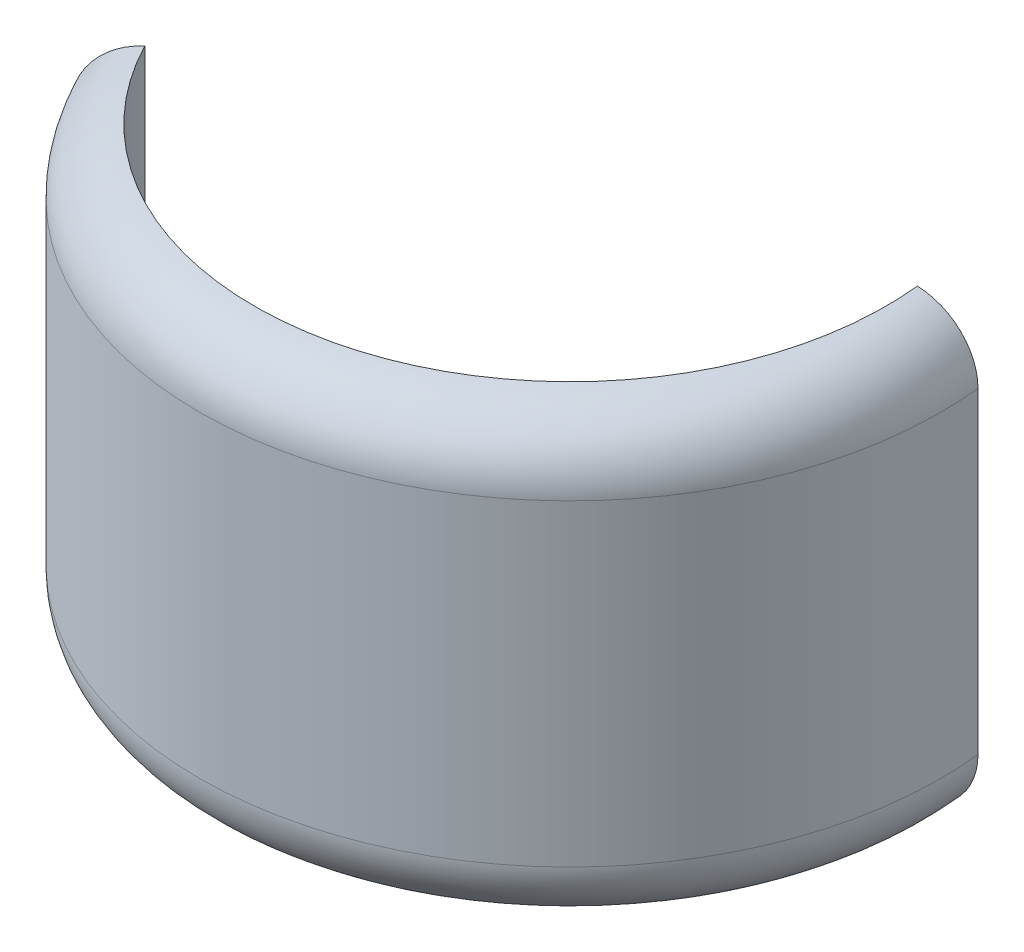
ISO-10303-21;
HEADER;
FILE_DESCRIPTION(('STEP AP214'),'2;1');
FILE_NAME('part.step','',(''),(''),'','','');
FILE_SCHEMA(('AUTOMOTIVE_DESIGN { 1 0 10303 214 1 1 1 1 }'));
ENDSEC;
DATA;
#1=APPLICATION_CONTEXT('core data for automotive mechanical design processes');
#2=APPLICATION_PROTOCOL_DEFINITION('international standard','automotive_design',2000,#1);
#3=PRODUCT_CONTEXT('',#1,'mechanical');
#4=PRODUCT('Part','Part','',(#3));
#5=PRODUCT_RELATED_PRODUCT_CATEGORY('part','',(#4));
#6=PRODUCT_DEFINITION_FORMATION('','',#4);
#7=PRODUCT_DEFINITION_CONTEXT('part definition',#1,'design');
#8=PRODUCT_DEFINITION('design','',#6,#7);
#9=PRODUCT_DEFINITION_SHAPE('','',#8);
#10=(LENGTH_UNIT() NAMED_UNIT(*) SI_UNIT(.MILLI.,.METRE.));
#11=(NAMED_UNIT(*) PLANE_ANGLE_UNIT() SI_UNIT($,.RADIAN.));
#12=(NAMED_UNIT(*) SI_UNIT($,.STERADIAN.) SOLID_ANGLE_UNIT());
#13=UNCERTAINTY_MEASURE_WITH_UNIT(LENGTH_MEASURE(1.E-05),#10,'distance_accuracy_value','');
#14=(GEOMETRIC_REPRESENTATION_CONTEXT(3) GLOBAL_UNCERTAINTY_ASSIGNED_CONTEXT((#13)) GLOBAL_UNIT_ASSIGNED_CONTEXT((#10,
#11,#12)) REPRESENTATION_CONTEXT('',''));
#15=CARTESIAN_POINT('',(0.,0.,0.));
#16=DIRECTION('',(0.,0.,1.));
#17=DIRECTION('',(1.,0.,0.));
#18=AXIS2_PLACEMENT_3D('',#15,#16,#17);
#19=CARTESIAN_POINT('',(-3.77287790207848,24.,-7.28249741853994));
#20=DIRECTION('',(-0.460006586639694,0.,-0.887915502876314));
#21=DIRECTION('',(-0.887915502876314,0.,0.460006586639694));
#22=AXIS2_PLACEMENT_3D('',#19,#20,#21);
#23=PLANE('',#22);
#24=DIRECTION('',(0.,-1.,0.));
#25=VECTOR('',#24,1.);
#26=CARTESIAN_POINT('',(-19.5296602889332,24.,0.880693401669399));
#27=LINE('',#26,#25);
#28=CARTESIAN_POINT('',(-19.5296602889332,24.,0.880693401669399));
#29=VERTEX_POINT('',#28);
#30=CARTESIAN_POINT('',(-19.5296602889332,0.,0.880693401669399));
#31=VERTEX_POINT('',#30);
#32=EDGE_CURVE('E102',#29,#31,#27,.T.);
#33=ORIENTED_EDGE('',*,*,#32,.T.);
#34=CARTESIAN_POINT('',(-19.0562679831169,3.45915464973892,0.635440809463784));
#35=DIRECTION('',(-0.460006586639694,0.,-0.887915502876314));
#36=DIRECTION('',(-0.887915502876314,0.,0.460006586639694));
#37=AXIS2_PLACEMENT_3D('',#34,#35,#36);
#38=CIRCLE('',#37,3.5);
#39=CARTESIAN_POINT('',(-22.163972243184,3.45915464973892,2.24546386270271));
#40=VERTEX_POINT('',#39);
#41=EDGE_CURVE('E11',#31,#40,#38,.T.);
#42=ORIENTED_EDGE('',*,*,#41,.T.);
#43=DIRECTION('',(0.,-1.,0.));
#44=VECTOR('',#43,1.);
#45=CARTESIAN_POINT('',(-22.163972243184,24.,2.24546386270265));
#46=LINE('',#45,#44);
#47=CARTESIAN_POINT('',(-22.163972243184,20.5408453502611,2.24546386270271));
#48=VERTEX_POINT('',#47);
#49=EDGE_CURVE('E116',#48,#40,#46,.T.);
#50=ORIENTED_EDGE('',*,*,#49,.F.);
#51=CARTESIAN_POINT('',(-19.0562679831169,20.5408453502611,0.635440809463784));
#52=DIRECTION('',(-0.460006586639694,0.,-0.887915502876314));
#53=DIRECTION('',(-0.887915502876314,0.,0.460006586639694));
#54=AXIS2_PLACEMENT_3D('',#51,#52,#53);
#55=CIRCLE('',#54,3.5);
#56=EDGE_CURVE('E52',#48,#29,#55,.T.);
#57=ORIENTED_EDGE('',*,*,#56,.T.);
#58=EDGE_LOOP('',(#33,#42,#50,#57));
#59=FACE_BOUND('',#58,.T.);
#60=ADVANCED_FACE('F43',(#59),#23,.T.);
#61=CARTESIAN_POINT('',(-4.43509674003582,24.,-6.93941857120534));
#62=DIRECTION('',(0.,-1.,0.));
#63=DIRECTION('',(0.,0.,-1.));
#64=AXIS2_PLACEMENT_3D('',#61,#62,#63);
#65=CYLINDRICAL_SURFACE('',#64,19.9668498249183);
#66=ORIENTED_EDGE('',*,*,#49,.T.);
#67=CARTESIAN_POINT('',(-4.43509674003582,3.45915464973891,-6.93941857120534));
#68=DIRECTION('',(0.,-1.,0.));
#69=DIRECTION('',(0.,0.,-1.));
#70=AXIS2_PLACEMENT_3D('',#67,#68,#69);
#71=CIRCLE('',#70,19.9668498249183);
#72=CARTESIAN_POINT('',(15.4198481847261,3.45915464973892,-9.05040269372014));
#73=VERTEX_POINT('',#72);
#74=EDGE_CURVE('E92',#40,#73,#71,.F.);
#75=ORIENTED_EDGE('',*,*,#74,.T.);
#76=DIRECTION('',(0.,-1.,0.));
#77=VECTOR('',#76,1.);
#78=CARTESIAN_POINT('',(15.4198481847261,24.,-9.05040269372014));
#79=LINE('',#78,#77);
#80=CARTESIAN_POINT('',(15.4198481847261,20.5408453502611,-9.05040269372014));
#81=VERTEX_POINT('',#80);
#82=EDGE_CURVE('E101',#81,#73,#79,.T.);
#83=ORIENTED_EDGE('',*,*,#82,.F.);
#84=CARTESIAN_POINT('',(-4.43509674003582,20.5408453502611,-6.93941857120534));
#85=DIRECTION('',(0.,1.,0.));
#86=DIRECTION('',(0.,0.,1.));
#87=AXIS2_PLACEMENT_3D('',#84,#85,#86);
#88=CIRCLE('',#87,19.9668498249183);
#89=EDGE_CURVE('E64',#81,#48,#88,.F.);
#90=ORIENTED_EDGE('',*,*,#89,.T.);
#91=EDGE_LOOP('',(#66,#75,#83,#90));
#92=FACE_BOUND('',#91,.T.);
#93=ADVANCED_FACE('F127',(#92),#65,.T.);
#94=CARTESIAN_POINT('',(-0.779128317869406,24.,-7.32812230827709));
#95=DIRECTION('',(-0.105724445319378,0.,-0.994395465427065));
#96=DIRECTION('',(-0.994395465427065,0.,0.105724445319378));
#97=AXIS2_PLACEMENT_3D('',#94,#95,#96);
#98=PLANE('',#97);
#99=ORIENTED_EDGE('',*,*,#82,.T.);
#100=CARTESIAN_POINT('',(11.9394640557314,3.45915464973892,-8.68036713510232));
#101=DIRECTION('',(-0.105724445319378,0.,-0.994395465427065));
#102=DIRECTION('',(-0.994395465427065,0.,0.105724445319378));
#103=AXIS2_PLACEMENT_3D('',#100,#101,#102);
#104=CIRCLE('',#103,3.5);
#105=CARTESIAN_POINT('',(12.4696261722243,0.,-8.73673414163476));
#106=VERTEX_POINT('',#105);
#107=EDGE_CURVE('E91',#73,#106,#104,.T.);
#108=ORIENTED_EDGE('',*,*,#107,.T.);
#109=DIRECTION('',(0.,-1.,0.));
#110=VECTOR('',#109,1.);
#111=CARTESIAN_POINT('',(12.4696261722243,24.,-8.73673414163476));
#112=LINE('',#111,#110);
#113=CARTESIAN_POINT('',(12.4696261722243,24.,-8.73673414163476));
#114=VERTEX_POINT('',#113);
#115=EDGE_CURVE('E95',#114,#106,#112,.T.);
#116=ORIENTED_EDGE('',*,*,#115,.F.);
#117=CARTESIAN_POINT('',(11.9394640557314,20.5408453502611,-8.68036713510232));
#118=DIRECTION('',(-0.105724445319378,0.,-0.994395465427065));
#119=DIRECTION('',(-0.994395465427065,0.,0.105724445319378));
#120=AXIS2_PLACEMENT_3D('',#117,#118,#119);
#121=CIRCLE('',#120,3.5);
#122=EDGE_CURVE('E83',#114,#81,#121,.T.);
#123=ORIENTED_EDGE('',*,*,#122,.T.);
#124=EDGE_LOOP('',(#99,#108,#116,#123));
#125=FACE_BOUND('',#124,.T.);
#126=ADVANCED_FACE('F96',(#125),#98,.T.);
#127=CARTESIAN_POINT('',(-4.43509674003582,24.,-6.93941857120534));
#128=DIRECTION('',(0.,-1.,0.));
#129=DIRECTION('',(0.,0.,-1.));
#130=AXIS2_PLACEMENT_3D('',#127,#128,#129);
#131=CYLINDRICAL_SURFACE('',#130,17.);
#132=CARTESIAN_POINT('',(-4.43509674003582,0.,-6.93941857120534));
#133=DIRECTION('',(0.,1.,0.));
#134=DIRECTION('',(0.,0.,1.));
#135=AXIS2_PLACEMENT_3D('',#132,#133,#134);
#136=CIRCLE('',#135,17.);
#137=EDGE_CURVE('E107',#31,#106,#136,.T.);
#138=ORIENTED_EDGE('',*,*,#137,.F.);
#139=ORIENTED_EDGE('',*,*,#32,.F.);
#140=CARTESIAN_POINT('',(-4.43509674003582,24.,-6.93941857120534));
#141=DIRECTION('',(0.,1.,0.));
#142=DIRECTION('',(0.,0.,1.));
#143=AXIS2_PLACEMENT_3D('',#140,#141,#142);
#144=CIRCLE('',#143,17.);
#145=EDGE_CURVE('E87',#29,#114,#144,.T.);
#146=ORIENTED_EDGE('',*,*,#145,.T.);
#147=ORIENTED_EDGE('',*,*,#115,.T.);
#148=EDGE_LOOP('',(#138,#139,#146,#147));
#149=FACE_BOUND('',#148,.T.);
#150=ADVANCED_FACE('F105',(#149),#131,.F.);
#151=CARTESIAN_POINT('',(-4.43509674003582,3.45915464973892,-6.93941857120534));
#152=DIRECTION('',(0.,-1.,0.));
#153=DIRECTION('',(0.,0.,-1.));
#154=AXIS2_PLACEMENT_3D('',#151,#152,#153);
#155=TOROIDAL_SURFACE('',#154,16.4668498249183,3.5);
#156=ORIENTED_EDGE('',*,*,#41,.F.);
#157=ORIENTED_EDGE('',*,*,#137,.T.);
#158=ORIENTED_EDGE('',*,*,#107,.F.);
#159=ORIENTED_EDGE('',*,*,#74,.F.);
#160=EDGE_LOOP('',(#156,#157,#158,#159));
#161=FACE_BOUND('',#160,.T.);
#162=ADVANCED_FACE('F129',(#161),#155,.T.);
#163=CARTESIAN_POINT('',(-4.43509674003582,20.5408453502611,-6.93941857120534));
#164=DIRECTION('',(0.,1.,0.));
#165=DIRECTION('',(0.,0.,1.));
#166=AXIS2_PLACEMENT_3D('',#163,#164,#165);
#167=TOROIDAL_SURFACE('',#166,16.4668498249183,3.5);
#168=ORIENTED_EDGE('',*,*,#56,.F.);
#169=ORIENTED_EDGE('',*,*,#89,.F.);
#170=ORIENTED_EDGE('',*,*,#122,.F.);
#171=ORIENTED_EDGE('',*,*,#145,.F.);
#172=EDGE_LOOP('',(#168,#169,#170,#171));
#173=FACE_BOUND('',#172,.T.);
#174=ADVANCED_FACE('F45',(#173),#167,.T.);
#175=CLOSED_SHELL('',(#60,#93,#126,#150,#162,#174));
#176=MANIFOLD_SOLID_BREP('B2',#175);
#177=ADVANCED_BREP_SHAPE_REPRESENTATION('',(#18,#176),#14);
#178=SHAPE_DEFINITION_REPRESENTATION(#9,#177);
ENDSEC;
END-ISO-10303-21;
